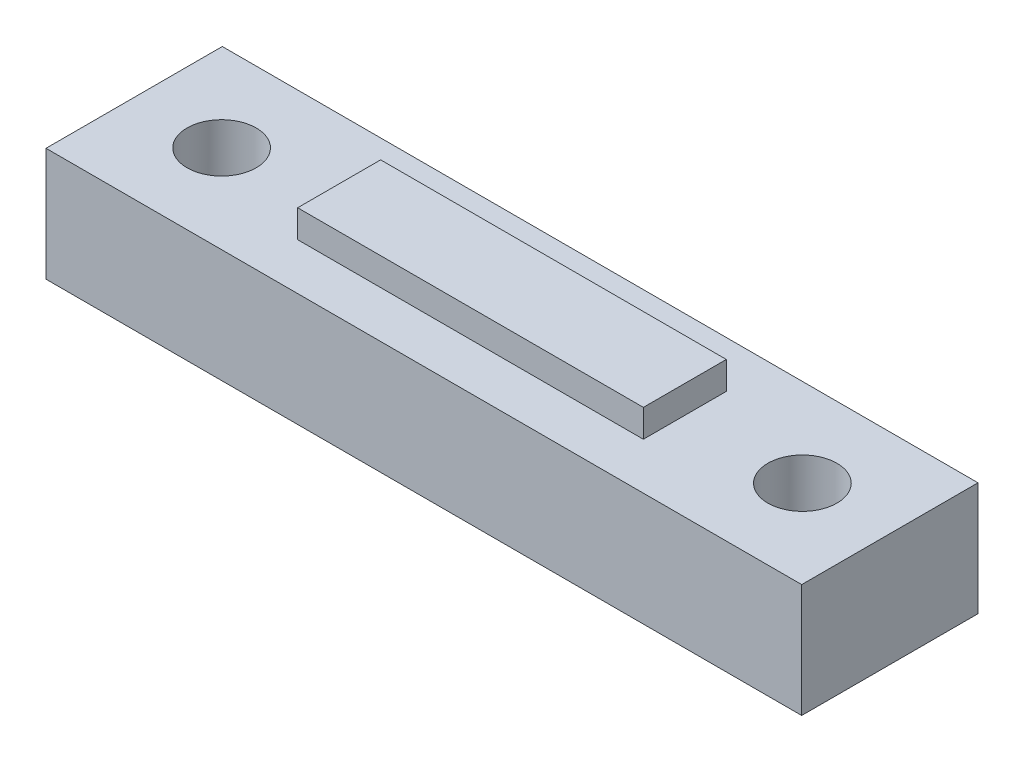
ISO-10303-21;
HEADER;
FILE_DESCRIPTION(('STEP AP214'),'2;1');
FILE_NAME('part.step','',(''),(''),'','','');
FILE_SCHEMA(('AUTOMOTIVE_DESIGN { 1 0 10303 214 1 1 1 1 }'));
ENDSEC;
DATA;
#1=APPLICATION_CONTEXT('core data for automotive mechanical design processes');
#2=APPLICATION_PROTOCOL_DEFINITION('international standard','automotive_design',2000,#1);
#3=PRODUCT_CONTEXT('',#1,'mechanical');
#4=PRODUCT('Part','Part','',(#3));
#5=PRODUCT_RELATED_PRODUCT_CATEGORY('part','',(#4));
#6=PRODUCT_DEFINITION_FORMATION('','',#4);
#7=PRODUCT_DEFINITION_CONTEXT('part definition',#1,'design');
#8=PRODUCT_DEFINITION('design','',#6,#7);
#9=PRODUCT_DEFINITION_SHAPE('','',#8);
#10=(LENGTH_UNIT() NAMED_UNIT(*) SI_UNIT(.MILLI.,.METRE.));
#11=(NAMED_UNIT(*) PLANE_ANGLE_UNIT() SI_UNIT($,.RADIAN.));
#12=(NAMED_UNIT(*) SI_UNIT($,.STERADIAN.) SOLID_ANGLE_UNIT());
#13=UNCERTAINTY_MEASURE_WITH_UNIT(LENGTH_MEASURE(1.E-05),#10,'distance_accuracy_value','');
#14=(GEOMETRIC_REPRESENTATION_CONTEXT(3) GLOBAL_UNCERTAINTY_ASSIGNED_CONTEXT((#13)) GLOBAL_UNIT_ASSIGNED_CONTEXT((#10,
#11,#12)) REPRESENTATION_CONTEXT('',''));
#15=CARTESIAN_POINT('',(0.,0.,0.));
#16=DIRECTION('',(0.,0.,1.));
#17=DIRECTION('',(1.,0.,0.));
#18=AXIS2_PLACEMENT_3D('',#15,#16,#17);
#19=CARTESIAN_POINT('',(0.,8.2,0.));
#20=DIRECTION('',(0.,-1.,0.));
#21=DIRECTION('',(0.,0.,-1.));
#22=AXIS2_PLACEMENT_3D('',#19,#20,#21);
#23=PLANE('',#22);
#24=DIRECTION('',(0.,0.,1.));
#25=VECTOR('',#24,1.);
#26=CARTESIAN_POINT('',(0.,8.2,0.));
#27=LINE('',#26,#25);
#28=CARTESIAN_POINT('',(0.,8.2,-12.75));
#29=VERTEX_POINT('',#28);
#30=CARTESIAN_POINT('',(0.,8.2,0.));
#31=VERTEX_POINT('',#30);
#32=EDGE_CURVE('E133',#29,#31,#27,.T.);
#33=ORIENTED_EDGE('',*,*,#32,.T.);
#34=DIRECTION('',(1.,0.,0.));
#35=VECTOR('',#34,1.);
#36=CARTESIAN_POINT('',(0.,8.2,0.));
#37=LINE('',#36,#35);
#38=CARTESIAN_POINT('',(54.65,8.2,0.));
#39=VERTEX_POINT('',#38);
#40=EDGE_CURVE('E136',#31,#39,#37,.T.);
#41=ORIENTED_EDGE('',*,*,#40,.T.);
#42=DIRECTION('',(0.,0.,-1.));
#43=VECTOR('',#42,1.);
#44=CARTESIAN_POINT('',(54.65,8.2,0.));
#45=LINE('',#44,#43);
#46=CARTESIAN_POINT('',(54.65,8.2,-12.75));
#47=VERTEX_POINT('',#46);
#48=EDGE_CURVE('E139',#39,#47,#45,.T.);
#49=ORIENTED_EDGE('',*,*,#48,.T.);
#50=DIRECTION('',(-1.,0.,0.));
#51=VECTOR('',#50,1.);
#52=CARTESIAN_POINT('',(0.,8.2,-12.75));
#53=LINE('',#52,#51);
#54=EDGE_CURVE('E141',#47,#29,#53,.T.);
#55=ORIENTED_EDGE('',*,*,#54,.T.);
#56=EDGE_LOOP('',(#33,#41,#49,#55));
#57=FACE_BOUND('',#56,.T.);
#58=CARTESIAN_POINT('',(48.325,8.2,-6.375));
#59=DIRECTION('',(0.,1.,0.));
#60=DIRECTION('',(0.,0.,1.));
#61=AXIS2_PLACEMENT_3D('',#58,#59,#60);
#62=CIRCLE('',#61,2.5);
#63=CARTESIAN_POINT('',(48.325,8.2,-3.875));
#64=VERTEX_POINT('',#63);
#65=EDGE_CURVE('E121',#64,#64,#62,.T.);
#66=ORIENTED_EDGE('',*,*,#65,.F.);
#67=EDGE_LOOP('',(#66));
#68=FACE_BOUND('',#67,.T.);
#69=CARTESIAN_POINT('',(6.325,8.2,-6.375));
#70=DIRECTION('',(0.,1.,0.));
#71=DIRECTION('',(0.,0.,1.));
#72=AXIS2_PLACEMENT_3D('',#69,#70,#71);
#73=CIRCLE('',#72,2.5);
#74=CARTESIAN_POINT('',(6.325,8.2,-3.875));
#75=VERTEX_POINT('',#74);
#76=EDGE_CURVE('E124',#75,#75,#73,.T.);
#77=ORIENTED_EDGE('',*,*,#76,.F.);
#78=EDGE_LOOP('',(#77));
#79=FACE_BOUND('',#78,.T.);
#80=DIRECTION('',(0.,0.,-1.));
#81=VECTOR('',#80,1.);
#82=CARTESIAN_POINT('',(39.825,8.2,-3.375));
#83=LINE('',#82,#81);
#84=CARTESIAN_POINT('',(39.825,8.2,-3.375));
#85=VERTEX_POINT('',#84);
#86=CARTESIAN_POINT('',(39.825,8.2,-9.375));
#87=VERTEX_POINT('',#86);
#88=EDGE_CURVE('E120',#85,#87,#83,.T.);
#89=ORIENTED_EDGE('',*,*,#88,.F.);
#90=DIRECTION('',(1.,0.,0.));
#91=VECTOR('',#90,1.);
#92=CARTESIAN_POINT('',(39.825,8.2,-3.375));
#93=LINE('',#92,#91);
#94=CARTESIAN_POINT('',(14.825,8.2,-3.375));
#95=VERTEX_POINT('',#94);
#96=EDGE_CURVE('E117',#95,#85,#93,.T.);
#97=ORIENTED_EDGE('',*,*,#96,.F.);
#98=DIRECTION('',(0.,0.,1.));
#99=VECTOR('',#98,1.);
#100=CARTESIAN_POINT('',(14.825,8.2,-3.375));
#101=LINE('',#100,#99);
#102=CARTESIAN_POINT('',(14.825,8.2,-9.375));
#103=VERTEX_POINT('',#102);
#104=EDGE_CURVE('E55',#103,#95,#101,.T.);
#105=ORIENTED_EDGE('',*,*,#104,.F.);
#106=DIRECTION('',(-1.,0.,0.));
#107=VECTOR('',#106,1.);
#108=CARTESIAN_POINT('',(39.825,8.2,-9.375));
#109=LINE('',#108,#107);
#110=EDGE_CURVE('E50',#87,#103,#109,.T.);
#111=ORIENTED_EDGE('',*,*,#110,.F.);
#112=EDGE_LOOP('',(#89,#97,#105,#111));
#113=FACE_BOUND('',#112,.T.);
#114=ADVANCED_FACE('F33',(#57,#68,#79,#113),#23,.F.);
#115=CARTESIAN_POINT('',(0.,8.2,0.));
#116=DIRECTION('',(1.,0.,0.));
#117=DIRECTION('',(0.,0.,-1.));
#118=AXIS2_PLACEMENT_3D('',#115,#116,#117);
#119=PLANE('',#118);
#120=DIRECTION('',(0.,0.,1.));
#121=VECTOR('',#120,1.);
#122=CARTESIAN_POINT('',(0.,0.,0.));
#123=LINE('',#122,#121);
#124=CARTESIAN_POINT('',(0.,0.,-12.75));
#125=VERTEX_POINT('',#124);
#126=CARTESIAN_POINT('',(0.,0.,0.));
#127=VERTEX_POINT('',#126);
#128=EDGE_CURVE('E144',#125,#127,#123,.T.);
#129=ORIENTED_EDGE('',*,*,#128,.T.);
#130=DIRECTION('',(0.,-1.,0.));
#131=VECTOR('',#130,1.);
#132=CARTESIAN_POINT('',(0.,8.2,0.));
#133=LINE('',#132,#131);
#134=EDGE_CURVE('E11',#31,#127,#133,.T.);
#135=ORIENTED_EDGE('',*,*,#134,.F.);
#136=ORIENTED_EDGE('',*,*,#32,.F.);
#137=DIRECTION('',(0.,-1.,0.));
#138=VECTOR('',#137,1.);
#139=CARTESIAN_POINT('',(0.,8.2,-12.75));
#140=LINE('',#139,#138);
#141=EDGE_CURVE('E143',#29,#125,#140,.T.);
#142=ORIENTED_EDGE('',*,*,#141,.T.);
#143=EDGE_LOOP('',(#129,#135,#136,#142));
#144=FACE_BOUND('',#143,.T.);
#145=ADVANCED_FACE('F35',(#144),#119,.F.);
#146=CARTESIAN_POINT('',(0.,8.2,0.));
#147=DIRECTION('',(0.,0.,-1.));
#148=DIRECTION('',(-1.,0.,0.));
#149=AXIS2_PLACEMENT_3D('',#146,#147,#148);
#150=PLANE('',#149);
#151=DIRECTION('',(1.,0.,0.));
#152=VECTOR('',#151,1.);
#153=CARTESIAN_POINT('',(0.,0.,0.));
#154=LINE('',#153,#152);
#155=CARTESIAN_POINT('',(54.65,0.,0.));
#156=VERTEX_POINT('',#155);
#157=EDGE_CURVE('E147',#127,#156,#154,.T.);
#158=ORIENTED_EDGE('',*,*,#157,.T.);
#159=DIRECTION('',(0.,-1.,0.));
#160=VECTOR('',#159,1.);
#161=CARTESIAN_POINT('',(54.65,8.2,0.));
#162=LINE('',#161,#160);
#163=EDGE_CURVE('E42',#39,#156,#162,.T.);
#164=ORIENTED_EDGE('',*,*,#163,.F.);
#165=ORIENTED_EDGE('',*,*,#40,.F.);
#166=ORIENTED_EDGE('',*,*,#134,.T.);
#167=EDGE_LOOP('',(#158,#164,#165,#166));
#168=FACE_BOUND('',#167,.T.);
#169=ADVANCED_FACE('F189',(#168),#150,.F.);
#170=CARTESIAN_POINT('',(54.65,8.2,0.));
#171=DIRECTION('',(-1.,0.,0.));
#172=DIRECTION('',(0.,0.,1.));
#173=AXIS2_PLACEMENT_3D('',#170,#171,#172);
#174=PLANE('',#173);
#175=DIRECTION('',(0.,0.,-1.));
#176=VECTOR('',#175,1.);
#177=CARTESIAN_POINT('',(54.65,0.,0.));
#178=LINE('',#177,#176);
#179=CARTESIAN_POINT('',(54.65,0.,-12.75));
#180=VERTEX_POINT('',#179);
#181=EDGE_CURVE('E149',#156,#180,#178,.T.);
#182=ORIENTED_EDGE('',*,*,#181,.T.);
#183=DIRECTION('',(0.,-1.,0.));
#184=VECTOR('',#183,1.);
#185=CARTESIAN_POINT('',(54.65,8.2,-12.75));
#186=LINE('',#185,#184);
#187=EDGE_CURVE('E154',#47,#180,#186,.T.);
#188=ORIENTED_EDGE('',*,*,#187,.F.);
#189=ORIENTED_EDGE('',*,*,#48,.F.);
#190=ORIENTED_EDGE('',*,*,#163,.T.);
#191=EDGE_LOOP('',(#182,#188,#189,#190));
#192=FACE_BOUND('',#191,.T.);
#193=ADVANCED_FACE('F186',(#192),#174,.F.);
#194=CARTESIAN_POINT('',(0.,8.2,-12.75));
#195=DIRECTION('',(0.,0.,1.));
#196=DIRECTION('',(1.,0.,0.));
#197=AXIS2_PLACEMENT_3D('',#194,#195,#196);
#198=PLANE('',#197);
#199=DIRECTION('',(-1.,0.,0.));
#200=VECTOR('',#199,1.);
#201=CARTESIAN_POINT('',(0.,0.,-12.75));
#202=LINE('',#201,#200);
#203=EDGE_CURVE('E137',#180,#125,#202,.T.);
#204=ORIENTED_EDGE('',*,*,#203,.T.);
#205=ORIENTED_EDGE('',*,*,#141,.F.);
#206=ORIENTED_EDGE('',*,*,#54,.F.);
#207=ORIENTED_EDGE('',*,*,#187,.T.);
#208=EDGE_LOOP('',(#204,#205,#206,#207));
#209=FACE_BOUND('',#208,.T.);
#210=ADVANCED_FACE('F171',(#209),#198,.F.);
#211=CARTESIAN_POINT('',(0.,0.,0.));
#212=DIRECTION('',(0.,-1.,0.));
#213=DIRECTION('',(0.,0.,-1.));
#214=AXIS2_PLACEMENT_3D('',#211,#212,#213);
#215=PLANE('',#214);
#216=CARTESIAN_POINT('',(6.325,0.,-6.375));
#217=DIRECTION('',(0.,-1.,0.));
#218=DIRECTION('',(0.,0.,-1.));
#219=AXIS2_PLACEMENT_3D('',#216,#217,#218);
#220=CIRCLE('',#219,2.5);
#221=CARTESIAN_POINT('',(6.325,0.,-8.875));
#222=VERTEX_POINT('',#221);
#223=EDGE_CURVE('E37',#222,#222,#220,.T.);
#224=ORIENTED_EDGE('',*,*,#223,.F.);
#225=EDGE_LOOP('',(#224));
#226=FACE_BOUND('',#225,.T.);
#227=CARTESIAN_POINT('',(48.325,0.,-6.375));
#228=DIRECTION('',(0.,-1.,0.));
#229=DIRECTION('',(0.,0.,-1.));
#230=AXIS2_PLACEMENT_3D('',#227,#228,#229);
#231=CIRCLE('',#230,2.5);
#232=CARTESIAN_POINT('',(48.325,0.,-8.875));
#233=VERTEX_POINT('',#232);
#234=EDGE_CURVE('E131',#233,#233,#231,.T.);
#235=ORIENTED_EDGE('',*,*,#234,.F.);
#236=EDGE_LOOP('',(#235));
#237=FACE_BOUND('',#236,.T.);
#238=ORIENTED_EDGE('',*,*,#128,.F.);
#239=ORIENTED_EDGE('',*,*,#203,.F.);
#240=ORIENTED_EDGE('',*,*,#181,.F.);
#241=ORIENTED_EDGE('',*,*,#157,.F.);
#242=EDGE_LOOP('',(#238,#239,#240,#241));
#243=FACE_BOUND('',#242,.T.);
#244=ADVANCED_FACE('F167',(#226,#237,#243),#215,.T.);
#245=CARTESIAN_POINT('',(48.325,-1.8,-6.375));
#246=DIRECTION('',(0.,1.,0.));
#247=DIRECTION('',(0.,0.,1.));
#248=AXIS2_PLACEMENT_3D('',#245,#246,#247);
#249=CYLINDRICAL_SURFACE('',#248,2.5);
#250=ORIENTED_EDGE('',*,*,#234,.T.);
#251=EDGE_LOOP('',(#250));
#252=FACE_BOUND('',#251,.T.);
#253=ORIENTED_EDGE('',*,*,#65,.T.);
#254=EDGE_LOOP('',(#253));
#255=FACE_BOUND('',#254,.T.);
#256=ADVANCED_FACE('F170',(#252,#255),#249,.F.);
#257=CARTESIAN_POINT('',(6.325,-1.8,-6.375));
#258=DIRECTION('',(0.,1.,0.));
#259=DIRECTION('',(0.,0.,1.));
#260=AXIS2_PLACEMENT_3D('',#257,#258,#259);
#261=CYLINDRICAL_SURFACE('',#260,2.5);
#262=ORIENTED_EDGE('',*,*,#223,.T.);
#263=EDGE_LOOP('',(#262));
#264=FACE_BOUND('',#263,.T.);
#265=ORIENTED_EDGE('',*,*,#76,.T.);
#266=EDGE_LOOP('',(#265));
#267=FACE_BOUND('',#266,.T.);
#268=ADVANCED_FACE('F164',(#264,#267),#261,.F.);
#269=CARTESIAN_POINT('',(39.825,10.2,-3.375));
#270=DIRECTION('',(-1.,0.,0.));
#271=DIRECTION('',(0.,0.,1.));
#272=AXIS2_PLACEMENT_3D('',#269,#270,#271);
#273=PLANE('',#272);
#274=ORIENTED_EDGE('',*,*,#88,.T.);
#275=DIRECTION('',(0.,-1.,0.));
#276=VECTOR('',#275,1.);
#277=CARTESIAN_POINT('',(39.825,10.2,-9.375));
#278=LINE('',#277,#276);
#279=CARTESIAN_POINT('',(39.825,10.2,-9.375));
#280=VERTEX_POINT('',#279);
#281=EDGE_CURVE('E101',#280,#87,#278,.T.);
#282=ORIENTED_EDGE('',*,*,#281,.F.);
#283=DIRECTION('',(0.,0.,-1.));
#284=VECTOR('',#283,1.);
#285=CARTESIAN_POINT('',(39.825,10.2,-3.375));
#286=LINE('',#285,#284);
#287=CARTESIAN_POINT('',(39.825,10.2,-3.375));
#288=VERTEX_POINT('',#287);
#289=EDGE_CURVE('E108',#288,#280,#286,.T.);
#290=ORIENTED_EDGE('',*,*,#289,.F.);
#291=DIRECTION('',(0.,-1.,0.));
#292=VECTOR('',#291,1.);
#293=CARTESIAN_POINT('',(39.825,10.2,-3.375));
#294=LINE('',#293,#292);
#295=EDGE_CURVE('E202',#288,#85,#294,.T.);
#296=ORIENTED_EDGE('',*,*,#295,.T.);
#297=EDGE_LOOP('',(#274,#282,#290,#296));
#298=FACE_BOUND('',#297,.T.);
#299=ADVANCED_FACE('F119',(#298),#273,.F.);
#300=CARTESIAN_POINT('',(39.825,10.2,-9.375));
#301=DIRECTION('',(0.,0.,1.));
#302=DIRECTION('',(1.,0.,0.));
#303=AXIS2_PLACEMENT_3D('',#300,#301,#302);
#304=PLANE('',#303);
#305=ORIENTED_EDGE('',*,*,#110,.T.);
#306=DIRECTION('',(0.,-1.,0.));
#307=VECTOR('',#306,1.);
#308=CARTESIAN_POINT('',(14.825,10.2,-9.375));
#309=LINE('',#308,#307);
#310=CARTESIAN_POINT('',(14.825,10.2,-9.375));
#311=VERTEX_POINT('',#310);
#312=EDGE_CURVE('E104',#311,#103,#309,.T.);
#313=ORIENTED_EDGE('',*,*,#312,.F.);
#314=DIRECTION('',(-1.,0.,0.));
#315=VECTOR('',#314,1.);
#316=CARTESIAN_POINT('',(39.825,10.2,-9.375));
#317=LINE('',#316,#315);
#318=EDGE_CURVE('E97',#280,#311,#317,.T.);
#319=ORIENTED_EDGE('',*,*,#318,.F.);
#320=ORIENTED_EDGE('',*,*,#281,.T.);
#321=EDGE_LOOP('',(#305,#313,#319,#320));
#322=FACE_BOUND('',#321,.T.);
#323=ADVANCED_FACE('F99',(#322),#304,.F.);
#324=CARTESIAN_POINT('',(14.825,10.2,-3.375));
#325=DIRECTION('',(1.,0.,0.));
#326=DIRECTION('',(0.,0.,-1.));
#327=AXIS2_PLACEMENT_3D('',#324,#325,#326);
#328=PLANE('',#327);
#329=ORIENTED_EDGE('',*,*,#104,.T.);
#330=DIRECTION('',(0.,-1.,0.));
#331=VECTOR('',#330,1.);
#332=CARTESIAN_POINT('',(14.825,10.2,-3.375));
#333=LINE('',#332,#331);
#334=CARTESIAN_POINT('',(14.825,10.2,-3.375));
#335=VERTEX_POINT('',#334);
#336=EDGE_CURVE('E126',#335,#95,#333,.T.);
#337=ORIENTED_EDGE('',*,*,#336,.F.);
#338=DIRECTION('',(0.,0.,1.));
#339=VECTOR('',#338,1.);
#340=CARTESIAN_POINT('',(14.825,10.2,-3.375));
#341=LINE('',#340,#339);
#342=EDGE_CURVE('E107',#311,#335,#341,.T.);
#343=ORIENTED_EDGE('',*,*,#342,.F.);
#344=ORIENTED_EDGE('',*,*,#312,.T.);
#345=EDGE_LOOP('',(#329,#337,#343,#344));
#346=FACE_BOUND('',#345,.T.);
#347=ADVANCED_FACE('F211',(#346),#328,.F.);
#348=CARTESIAN_POINT('',(39.825,10.2,-3.375));
#349=DIRECTION('',(0.,0.,-1.));
#350=DIRECTION('',(-1.,0.,0.));
#351=AXIS2_PLACEMENT_3D('',#348,#349,#350);
#352=PLANE('',#351);
#353=ORIENTED_EDGE('',*,*,#96,.T.);
#354=ORIENTED_EDGE('',*,*,#295,.F.);
#355=DIRECTION('',(1.,0.,0.));
#356=VECTOR('',#355,1.);
#357=CARTESIAN_POINT('',(39.825,10.2,-3.375));
#358=LINE('',#357,#356);
#359=EDGE_CURVE('E113',#335,#288,#358,.T.);
#360=ORIENTED_EDGE('',*,*,#359,.F.);
#361=ORIENTED_EDGE('',*,*,#336,.T.);
#362=EDGE_LOOP('',(#353,#354,#360,#361));
#363=FACE_BOUND('',#362,.T.);
#364=ADVANCED_FACE('F201',(#363),#352,.F.);
#365=CARTESIAN_POINT('',(0.,10.2,0.));
#366=DIRECTION('',(0.,1.,0.));
#367=DIRECTION('',(0.,0.,1.));
#368=AXIS2_PLACEMENT_3D('',#365,#366,#367);
#369=PLANE('',#368);
#370=ORIENTED_EDGE('',*,*,#289,.T.);
#371=ORIENTED_EDGE('',*,*,#318,.T.);
#372=ORIENTED_EDGE('',*,*,#342,.T.);
#373=ORIENTED_EDGE('',*,*,#359,.T.);
#374=EDGE_LOOP('',(#370,#371,#372,#373));
#375=FACE_BOUND('',#374,.T.);
#376=ADVANCED_FACE('F111',(#375),#369,.T.);
#377=CLOSED_SHELL('',(#114,#145,#169,#193,#210,#244,#256,#268,#299,#323,#347,#364,#376));
#378=MANIFOLD_SOLID_BREP('B2',#377);
#379=ADVANCED_BREP_SHAPE_REPRESENTATION('',(#18,#378),#14);
#380=SHAPE_DEFINITION_REPRESENTATION(#9,#379);
ENDSEC;
END-ISO-10303-21;
